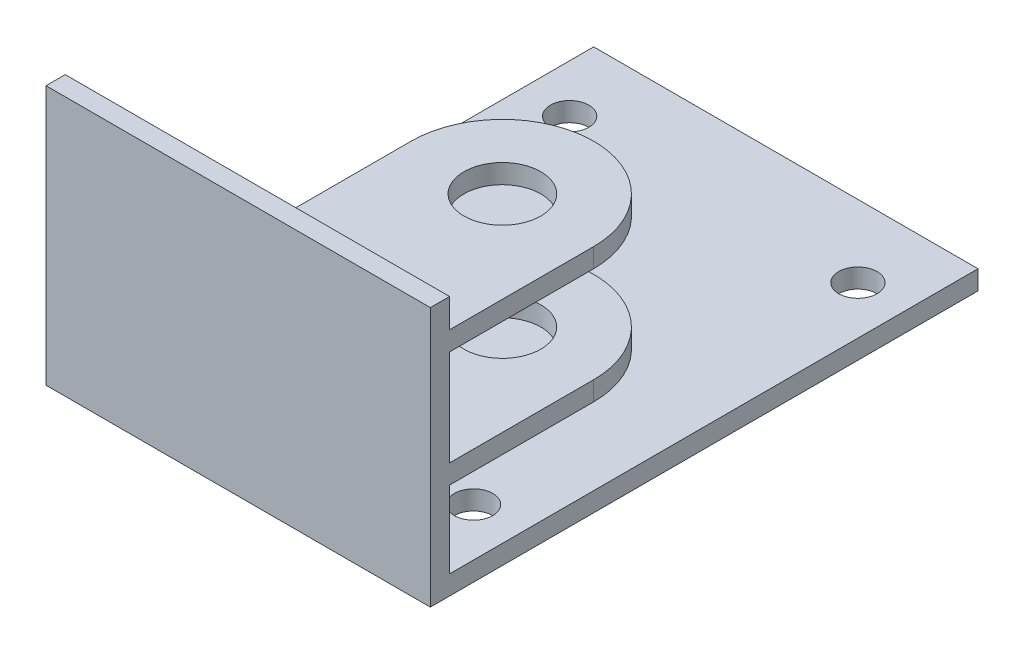
ISO-10303-21;
HEADER;
FILE_DESCRIPTION(('STEP AP214'),'2;1');
FILE_NAME('part.step','',(''),(''),'','','');
FILE_SCHEMA(('AUTOMOTIVE_DESIGN { 1 0 10303 214 1 1 1 1 }'));
ENDSEC;
DATA;
#1=APPLICATION_CONTEXT('core data for automotive mechanical design processes');
#2=APPLICATION_PROTOCOL_DEFINITION('international standard','automotive_design',2000,#1);
#3=PRODUCT_CONTEXT('',#1,'mechanical');
#4=PRODUCT('Part','Part','',(#3));
#5=PRODUCT_RELATED_PRODUCT_CATEGORY('part','',(#4));
#6=PRODUCT_DEFINITION_FORMATION('','',#4);
#7=PRODUCT_DEFINITION_CONTEXT('part definition',#1,'design');
#8=PRODUCT_DEFINITION('design','',#6,#7);
#9=PRODUCT_DEFINITION_SHAPE('','',#8);
#10=(LENGTH_UNIT() NAMED_UNIT(*) SI_UNIT(.MILLI.,.METRE.));
#11=(NAMED_UNIT(*) PLANE_ANGLE_UNIT() SI_UNIT($,.RADIAN.));
#12=(NAMED_UNIT(*) SI_UNIT($,.STERADIAN.) SOLID_ANGLE_UNIT());
#13=UNCERTAINTY_MEASURE_WITH_UNIT(LENGTH_MEASURE(1.E-05),#10,'distance_accuracy_value','');
#14=(GEOMETRIC_REPRESENTATION_CONTEXT(3) GLOBAL_UNCERTAINTY_ASSIGNED_CONTEXT((#13)) GLOBAL_UNIT_ASSIGNED_CONTEXT((#10,
#11,#12)) REPRESENTATION_CONTEXT('',''));
#15=CARTESIAN_POINT('',(0.,0.,0.));
#16=DIRECTION('',(0.,0.,1.));
#17=DIRECTION('',(1.,0.,0.));
#18=AXIS2_PLACEMENT_3D('',#15,#16,#17);
#19=CARTESIAN_POINT('',(0.,2.,0.));
#20=DIRECTION('',(0.,-1.,0.));
#21=DIRECTION('',(0.,0.,-1.));
#22=AXIS2_PLACEMENT_3D('',#19,#20,#21);
#23=PLANE('',#22);
#24=DIRECTION('',(0.,0.,1.));
#25=VECTOR('',#24,1.);
#26=CARTESIAN_POINT('',(0.,2.,0.));
#27=LINE('',#26,#25);
#28=CARTESIAN_POINT('',(0.,2.,-55.));
#29=VERTEX_POINT('',#28);
#30=CARTESIAN_POINT('',(0.,2.00000000000002,0.));
#31=VERTEX_POINT('',#30);
#32=EDGE_CURVE('E195',#29,#31,#27,.T.);
#33=ORIENTED_EDGE('',*,*,#32,.T.);
#34=DIRECTION('',(1.,0.,0.));
#35=VECTOR('',#34,1.);
#36=CARTESIAN_POINT('',(0.,2.,0.));
#37=LINE('',#36,#35);
#38=CARTESIAN_POINT('',(40.,2.,0.));
#39=VERTEX_POINT('',#38);
#40=EDGE_CURVE('E154',#31,#39,#37,.T.);
#41=ORIENTED_EDGE('',*,*,#40,.T.);
#42=DIRECTION('',(0.,0.,-1.));
#43=VECTOR('',#42,1.);
#44=CARTESIAN_POINT('',(40.,2.,0.));
#45=LINE('',#44,#43);
#46=CARTESIAN_POINT('',(40.,2.,-55.));
#47=VERTEX_POINT('',#46);
#48=EDGE_CURVE('E199',#39,#47,#45,.T.);
#49=ORIENTED_EDGE('',*,*,#48,.T.);
#50=DIRECTION('',(-1.,0.,0.));
#51=VECTOR('',#50,1.);
#52=CARTESIAN_POINT('',(0.,2.,-55.));
#53=LINE('',#52,#51);
#54=EDGE_CURVE('E201',#47,#29,#53,.T.);
#55=ORIENTED_EDGE('',*,*,#54,.T.);
#56=EDGE_LOOP('',(#33,#41,#49,#55));
#57=FACE_BOUND('',#56,.T.);
#58=CARTESIAN_POINT('',(5.,2.,-47.5));
#59=DIRECTION('',(0.,1.,0.));
#60=DIRECTION('',(0.,0.,1.));
#61=AXIS2_PLACEMENT_3D('',#58,#59,#60);
#62=CIRCLE('',#61,2.);
#63=CARTESIAN_POINT('',(5.,2.,-45.5));
#64=VERTEX_POINT('',#63);
#65=EDGE_CURVE('E189',#64,#64,#62,.T.);
#66=ORIENTED_EDGE('',*,*,#65,.F.);
#67=EDGE_LOOP('',(#66));
#68=FACE_BOUND('',#67,.T.);
#69=CARTESIAN_POINT('',(35.,2.,-47.5));
#70=DIRECTION('',(0.,1.,0.));
#71=DIRECTION('',(0.,0.,1.));
#72=AXIS2_PLACEMENT_3D('',#69,#70,#71);
#73=CIRCLE('',#72,2.);
#74=CARTESIAN_POINT('',(35.,2.,-45.5));
#75=VERTEX_POINT('',#74);
#76=EDGE_CURVE('E183',#75,#75,#73,.T.);
#77=ORIENTED_EDGE('',*,*,#76,.F.);
#78=EDGE_LOOP('',(#77));
#79=FACE_BOUND('',#78,.T.);
#80=CARTESIAN_POINT('',(35.,2.,-7.5));
#81=DIRECTION('',(0.,1.,0.));
#82=DIRECTION('',(0.,0.,1.));
#83=AXIS2_PLACEMENT_3D('',#80,#81,#82);
#84=CIRCLE('',#83,2.);
#85=CARTESIAN_POINT('',(35.,2.,-5.5));
#86=VERTEX_POINT('',#85);
#87=EDGE_CURVE('E177',#86,#86,#84,.T.);
#88=ORIENTED_EDGE('',*,*,#87,.F.);
#89=EDGE_LOOP('',(#88));
#90=FACE_BOUND('',#89,.T.);
#91=CARTESIAN_POINT('',(5.,2.,-7.5));
#92=DIRECTION('',(0.,1.,0.));
#93=DIRECTION('',(0.,0.,1.));
#94=AXIS2_PLACEMENT_3D('',#91,#92,#93);
#95=CIRCLE('',#94,2.);
#96=CARTESIAN_POINT('',(5.,2.,-5.5));
#97=VERTEX_POINT('',#96);
#98=EDGE_CURVE('E171',#97,#97,#95,.T.);
#99=ORIENTED_EDGE('',*,*,#98,.F.);
#100=EDGE_LOOP('',(#99));
#101=FACE_BOUND('',#100,.T.);
#102=ADVANCED_FACE('F37',(#57,#68,#79,#90,#101),#23,.F.);
#103=CARTESIAN_POINT('',(0.,0.,0.));
#104=DIRECTION('',(0.,-1.,0.));
#105=DIRECTION('',(0.,0.,-1.));
#106=AXIS2_PLACEMENT_3D('',#103,#104,#105);
#107=PLANE('',#106);
#108=CARTESIAN_POINT('',(35.,0.,-7.5));
#109=DIRECTION('',(0.,1.,0.));
#110=DIRECTION('',(0.,0.,1.));
#111=AXIS2_PLACEMENT_3D('',#108,#109,#110);
#112=CIRCLE('',#111,2.);
#113=CARTESIAN_POINT('',(35.,0.,-5.5));
#114=VERTEX_POINT('',#113);
#115=EDGE_CURVE('E174',#114,#114,#112,.T.);
#116=ORIENTED_EDGE('',*,*,#115,.T.);
#117=EDGE_LOOP('',(#116));
#118=FACE_BOUND('',#117,.T.);
#119=CARTESIAN_POINT('',(5.,0.,-47.5));
#120=DIRECTION('',(0.,1.,0.));
#121=DIRECTION('',(0.,0.,1.));
#122=AXIS2_PLACEMENT_3D('',#119,#120,#121);
#123=CIRCLE('',#122,2.);
#124=CARTESIAN_POINT('',(5.,0.,-45.5));
#125=VERTEX_POINT('',#124);
#126=EDGE_CURVE('E186',#125,#125,#123,.T.);
#127=ORIENTED_EDGE('',*,*,#126,.T.);
#128=EDGE_LOOP('',(#127));
#129=FACE_BOUND('',#128,.T.);
#130=DIRECTION('',(0.,0.,1.));
#131=VECTOR('',#130,1.);
#132=CARTESIAN_POINT('',(0.,0.,0.));
#133=LINE('',#132,#131);
#134=CARTESIAN_POINT('',(0.,0.,-55.));
#135=VERTEX_POINT('',#134);
#136=CARTESIAN_POINT('',(0.,0.,2.));
#137=VERTEX_POINT('',#136);
#138=EDGE_CURVE('E192',#135,#137,#133,.T.);
#139=ORIENTED_EDGE('',*,*,#138,.F.);
#140=DIRECTION('',(-1.,0.,0.));
#141=VECTOR('',#140,1.);
#142=CARTESIAN_POINT('',(0.,0.,-55.));
#143=LINE('',#142,#141);
#144=CARTESIAN_POINT('',(40.,0.,-55.));
#145=VERTEX_POINT('',#144);
#146=EDGE_CURVE('E197',#145,#135,#143,.T.);
#147=ORIENTED_EDGE('',*,*,#146,.F.);
#148=DIRECTION('',(0.,0.,-1.));
#149=VECTOR('',#148,1.);
#150=CARTESIAN_POINT('',(40.,0.,0.));
#151=LINE('',#150,#149);
#152=CARTESIAN_POINT('',(40.,0.,2.));
#153=VERTEX_POINT('',#152);
#154=EDGE_CURVE('E204',#153,#145,#151,.T.);
#155=ORIENTED_EDGE('',*,*,#154,.F.);
#156=DIRECTION('',(1.,0.,0.));
#157=VECTOR('',#156,1.);
#158=CARTESIAN_POINT('',(0.,0.,2.));
#159=LINE('',#158,#157);
#160=EDGE_CURVE('E157',#137,#153,#159,.T.);
#161=ORIENTED_EDGE('',*,*,#160,.F.);
#162=EDGE_LOOP('',(#139,#147,#155,#161));
#163=FACE_BOUND('',#162,.T.);
#164=CARTESIAN_POINT('',(35.,0.,-47.5));
#165=DIRECTION('',(0.,1.,0.));
#166=DIRECTION('',(0.,0.,1.));
#167=AXIS2_PLACEMENT_3D('',#164,#165,#166);
#168=CIRCLE('',#167,2.);
#169=CARTESIAN_POINT('',(35.,0.,-45.5));
#170=VERTEX_POINT('',#169);
#171=EDGE_CURVE('E180',#170,#170,#168,.T.);
#172=ORIENTED_EDGE('',*,*,#171,.T.);
#173=EDGE_LOOP('',(#172));
#174=FACE_BOUND('',#173,.T.);
#175=CARTESIAN_POINT('',(5.,0.,-7.5));
#176=DIRECTION('',(0.,1.,0.));
#177=DIRECTION('',(0.,0.,1.));
#178=AXIS2_PLACEMENT_3D('',#175,#176,#177);
#179=CIRCLE('',#178,2.);
#180=CARTESIAN_POINT('',(5.,0.,-5.5));
#181=VERTEX_POINT('',#180);
#182=EDGE_CURVE('E170',#181,#181,#179,.T.);
#183=ORIENTED_EDGE('',*,*,#182,.T.);
#184=EDGE_LOOP('',(#183));
#185=FACE_BOUND('',#184,.T.);
#186=ADVANCED_FACE('F214',(#118,#129,#163,#174,#185),#107,.T.);
#187=CARTESIAN_POINT('',(0.,2.,0.));
#188=DIRECTION('',(1.,0.,0.));
#189=DIRECTION('',(0.,0.,-1.));
#190=AXIS2_PLACEMENT_3D('',#187,#188,#189);
#191=PLANE('',#190);
#192=DIRECTION('',(0.,-1.,0.));
#193=VECTOR('',#192,1.);
#194=CARTESIAN_POINT('',(0.,42.,2.));
#195=LINE('',#194,#193);
#196=CARTESIAN_POINT('',(0.,27.,2.));
#197=VERTEX_POINT('',#196);
#198=EDGE_CURVE('E149',#197,#137,#195,.T.);
#199=ORIENTED_EDGE('',*,*,#198,.F.);
#200=DIRECTION('',(0.,0.,-1.));
#201=VECTOR('',#200,1.);
#202=CARTESIAN_POINT('',(0.,27.,10.));
#203=LINE('',#202,#201);
#204=CARTESIAN_POINT('',(0.,27.,0.));
#205=VERTEX_POINT('',#204);
#206=EDGE_CURVE('E138',#197,#205,#203,.T.);
#207=ORIENTED_EDGE('',*,*,#206,.T.);
#208=DIRECTION('',(0.,-1.,0.));
#209=VECTOR('',#208,1.);
#210=CARTESIAN_POINT('',(0.,42.,0.));
#211=LINE('',#210,#209);
#212=EDGE_CURVE('E146',#205,#31,#211,.T.);
#213=ORIENTED_EDGE('',*,*,#212,.T.);
#214=ORIENTED_EDGE('',*,*,#32,.F.);
#215=DIRECTION('',(0.,-1.,0.));
#216=VECTOR('',#215,1.);
#217=CARTESIAN_POINT('',(0.,2.,-55.));
#218=LINE('',#217,#216);
#219=EDGE_CURVE('E45',#29,#135,#218,.T.);
#220=ORIENTED_EDGE('',*,*,#219,.T.);
#221=ORIENTED_EDGE('',*,*,#138,.T.);
#222=EDGE_LOOP('',(#199,#207,#213,#214,#220,#221));
#223=FACE_BOUND('',#222,.T.);
#224=ADVANCED_FACE('F39',(#223),#191,.F.);
#225=CARTESIAN_POINT('',(40.,2.,0.));
#226=DIRECTION('',(-1.,0.,0.));
#227=DIRECTION('',(0.,0.,1.));
#228=AXIS2_PLACEMENT_3D('',#225,#226,#227);
#229=PLANE('',#228);
#230=DIRECTION('',(0.,-1.,0.));
#231=VECTOR('',#230,1.);
#232=CARTESIAN_POINT('',(40.,42.,0.));
#233=LINE('',#232,#231);
#234=CARTESIAN_POINT('',(40.,27.,0.));
#235=VERTEX_POINT('',#234);
#236=CARTESIAN_POINT('',(40.,24.,0.));
#237=VERTEX_POINT('',#236);
#238=EDGE_CURVE('E161',#235,#237,#233,.T.);
#239=ORIENTED_EDGE('',*,*,#238,.F.);
#240=DIRECTION('',(0.,0.,-1.));
#241=VECTOR('',#240,1.);
#242=CARTESIAN_POINT('',(40.,27.,10.));
#243=LINE('',#242,#241);
#244=CARTESIAN_POINT('',(40.,27.,2.));
#245=VERTEX_POINT('',#244);
#246=EDGE_CURVE('E52',#245,#235,#243,.T.);
#247=ORIENTED_EDGE('',*,*,#246,.F.);
#248=DIRECTION('',(0.,-1.,0.));
#249=VECTOR('',#248,1.);
#250=CARTESIAN_POINT('',(40.,42.,2.));
#251=LINE('',#250,#249);
#252=EDGE_CURVE('E167',#245,#153,#251,.T.);
#253=ORIENTED_EDGE('',*,*,#252,.T.);
#254=ORIENTED_EDGE('',*,*,#154,.T.);
#255=DIRECTION('',(0.,-1.,0.));
#256=VECTOR('',#255,1.);
#257=CARTESIAN_POINT('',(40.,2.,-55.));
#258=LINE('',#257,#256);
#259=EDGE_CURVE('E11',#47,#145,#258,.T.);
#260=ORIENTED_EDGE('',*,*,#259,.F.);
#261=ORIENTED_EDGE('',*,*,#48,.F.);
#262=CARTESIAN_POINT('',(40.,10.,0.));
#263=VERTEX_POINT('',#262);
#264=EDGE_CURVE('E156',#263,#39,#233,.T.);
#265=ORIENTED_EDGE('',*,*,#264,.F.);
#266=DIRECTION('',(0.,0.,-1.));
#267=VECTOR('',#266,1.);
#268=CARTESIAN_POINT('',(40.,10.,-15.));
#269=LINE('',#268,#267);
#270=CARTESIAN_POINT('',(40.,10.,-15.));
#271=VERTEX_POINT('',#270);
#272=EDGE_CURVE('E234',#263,#271,#269,.T.);
#273=ORIENTED_EDGE('',*,*,#272,.T.);
#274=DIRECTION('',(0.,-1.,0.));
#275=VECTOR('',#274,1.);
#276=CARTESIAN_POINT('',(40.,12.,-15.));
#277=LINE('',#276,#275);
#278=CARTESIAN_POINT('',(40.,12.,-15.));
#279=VERTEX_POINT('',#278);
#280=EDGE_CURVE('E239',#279,#271,#277,.T.);
#281=ORIENTED_EDGE('',*,*,#280,.F.);
#282=DIRECTION('',(0.,0.,-1.));
#283=VECTOR('',#282,1.);
#284=CARTESIAN_POINT('',(40.,12.,-15.));
#285=LINE('',#284,#283);
#286=CARTESIAN_POINT('',(40.,12.,0.));
#287=VERTEX_POINT('',#286);
#288=EDGE_CURVE('E237',#287,#279,#285,.T.);
#289=ORIENTED_EDGE('',*,*,#288,.F.);
#290=CARTESIAN_POINT('',(40.,22.,0.));
#291=VERTEX_POINT('',#290);
#292=EDGE_CURVE('E159',#291,#287,#233,.T.);
#293=ORIENTED_EDGE('',*,*,#292,.F.);
#294=DIRECTION('',(0.,0.,-1.));
#295=VECTOR('',#294,1.);
#296=CARTESIAN_POINT('',(40.,22.,-15.));
#297=LINE('',#296,#295);
#298=CARTESIAN_POINT('',(40.,22.,-15.));
#299=VERTEX_POINT('',#298);
#300=EDGE_CURVE('E267',#291,#299,#297,.T.);
#301=ORIENTED_EDGE('',*,*,#300,.T.);
#302=DIRECTION('',(0.,-1.,0.));
#303=VECTOR('',#302,1.);
#304=CARTESIAN_POINT('',(40.,24.,-15.));
#305=LINE('',#304,#303);
#306=CARTESIAN_POINT('',(40.,24.,-15.));
#307=VERTEX_POINT('',#306);
#308=EDGE_CURVE('E275',#307,#299,#305,.T.);
#309=ORIENTED_EDGE('',*,*,#308,.F.);
#310=DIRECTION('',(0.,0.,-1.));
#311=VECTOR('',#310,1.);
#312=CARTESIAN_POINT('',(40.,24.,-15.));
#313=LINE('',#312,#311);
#314=EDGE_CURVE('E273',#237,#307,#313,.T.);
#315=ORIENTED_EDGE('',*,*,#314,.F.);
#316=EDGE_LOOP('',(#239,#247,#253,#254,#260,#261,#265,#273,#281,#289,#293,#301,#309,#315));
#317=FACE_BOUND('',#316,.T.);
#318=ADVANCED_FACE('F308',(#317),#229,.F.);
#319=CARTESIAN_POINT('',(0.,2.,-55.));
#320=DIRECTION('',(0.,0.,1.));
#321=DIRECTION('',(1.,0.,0.));
#322=AXIS2_PLACEMENT_3D('',#319,#320,#321);
#323=PLANE('',#322);
#324=ORIENTED_EDGE('',*,*,#146,.T.);
#325=ORIENTED_EDGE('',*,*,#219,.F.);
#326=ORIENTED_EDGE('',*,*,#54,.F.);
#327=ORIENTED_EDGE('',*,*,#259,.T.);
#328=EDGE_LOOP('',(#324,#325,#326,#327));
#329=FACE_BOUND('',#328,.T.);
#330=ADVANCED_FACE('F351',(#329),#323,.F.);
#331=CARTESIAN_POINT('',(5.,2.,-47.5));
#332=DIRECTION('',(0.,-1.,0.));
#333=DIRECTION('',(0.,0.,-1.));
#334=AXIS2_PLACEMENT_3D('',#331,#332,#333);
#335=CYLINDRICAL_SURFACE('',#334,2.);
#336=ORIENTED_EDGE('',*,*,#65,.T.);
#337=EDGE_LOOP('',(#336));
#338=FACE_BOUND('',#337,.T.);
#339=ORIENTED_EDGE('',*,*,#126,.F.);
#340=EDGE_LOOP('',(#339));
#341=FACE_BOUND('',#340,.T.);
#342=ADVANCED_FACE('F348',(#338,#341),#335,.F.);
#343=CARTESIAN_POINT('',(35.,2.,-47.5));
#344=DIRECTION('',(0.,-1.,0.));
#345=DIRECTION('',(0.,0.,-1.));
#346=AXIS2_PLACEMENT_3D('',#343,#344,#345);
#347=CYLINDRICAL_SURFACE('',#346,2.);
#348=ORIENTED_EDGE('',*,*,#76,.T.);
#349=EDGE_LOOP('',(#348));
#350=FACE_BOUND('',#349,.T.);
#351=ORIENTED_EDGE('',*,*,#171,.F.);
#352=EDGE_LOOP('',(#351));
#353=FACE_BOUND('',#352,.T.);
#354=ADVANCED_FACE('F489',(#350,#353),#347,.F.);
#355=CARTESIAN_POINT('',(35.,2.,-7.5));
#356=DIRECTION('',(0.,-1.,0.));
#357=DIRECTION('',(0.,0.,-1.));
#358=AXIS2_PLACEMENT_3D('',#355,#356,#357);
#359=CYLINDRICAL_SURFACE('',#358,2.);
#360=ORIENTED_EDGE('',*,*,#87,.T.);
#361=EDGE_LOOP('',(#360));
#362=FACE_BOUND('',#361,.T.);
#363=ORIENTED_EDGE('',*,*,#115,.F.);
#364=EDGE_LOOP('',(#363));
#365=FACE_BOUND('',#364,.T.);
#366=ADVANCED_FACE('F479',(#362,#365),#359,.F.);
#367=CARTESIAN_POINT('',(5.,2.,-7.5));
#368=DIRECTION('',(0.,-1.,0.));
#369=DIRECTION('',(0.,0.,-1.));
#370=AXIS2_PLACEMENT_3D('',#367,#368,#369);
#371=CYLINDRICAL_SURFACE('',#370,2.);
#372=ORIENTED_EDGE('',*,*,#98,.T.);
#373=EDGE_LOOP('',(#372));
#374=FACE_BOUND('',#373,.T.);
#375=ORIENTED_EDGE('',*,*,#182,.F.);
#376=EDGE_LOOP('',(#375));
#377=FACE_BOUND('',#376,.T.);
#378=ADVANCED_FACE('F379',(#374,#377),#371,.F.);
#379=CARTESIAN_POINT('',(0.,42.,2.));
#380=DIRECTION('',(0.,0.,-1.));
#381=DIRECTION('',(-1.,0.,0.));
#382=AXIS2_PLACEMENT_3D('',#379,#380,#381);
#383=PLANE('',#382);
#384=ORIENTED_EDGE('',*,*,#252,.F.);
#385=DIRECTION('',(-1.,0.,0.));
#386=VECTOR('',#385,1.);
#387=CARTESIAN_POINT('',(0.,27.,2.));
#388=LINE('',#387,#386);
#389=EDGE_CURVE('E150',#245,#197,#388,.T.);
#390=ORIENTED_EDGE('',*,*,#389,.T.);
#391=ORIENTED_EDGE('',*,*,#198,.T.);
#392=ORIENTED_EDGE('',*,*,#160,.T.);
#393=EDGE_LOOP('',(#384,#390,#391,#392));
#394=FACE_BOUND('',#393,.T.);
#395=ADVANCED_FACE('F219',(#394),#383,.F.);
#396=CARTESIAN_POINT('',(0.,42.,0.));
#397=DIRECTION('',(0.,0.,1.));
#398=DIRECTION('',(1.,0.,0.));
#399=AXIS2_PLACEMENT_3D('',#396,#397,#398);
#400=PLANE('',#399);
#401=ORIENTED_EDGE('',*,*,#212,.F.);
#402=DIRECTION('',(-1.,0.,0.));
#403=VECTOR('',#402,1.);
#404=CARTESIAN_POINT('',(0.,27.,0.));
#405=LINE('',#404,#403);
#406=EDGE_CURVE('E135',#235,#205,#405,.T.);
#407=ORIENTED_EDGE('',*,*,#406,.F.);
#408=ORIENTED_EDGE('',*,*,#238,.T.);
#409=DIRECTION('',(1.,0.,0.));
#410=VECTOR('',#409,1.);
#411=CARTESIAN_POINT('',(40.,24.,0.));
#412=LINE('',#411,#410);
#413=CARTESIAN_POINT('',(21.,24.,0.));
#414=VERTEX_POINT('',#413);
#415=EDGE_CURVE('E270',#414,#237,#412,.T.);
#416=ORIENTED_EDGE('',*,*,#415,.F.);
#417=DIRECTION('',(0.,-1.,0.));
#418=VECTOR('',#417,1.);
#419=CARTESIAN_POINT('',(21.,24.,0.));
#420=LINE('',#419,#418);
#421=CARTESIAN_POINT('',(21.,22.,0.));
#422=VERTEX_POINT('',#421);
#423=EDGE_CURVE('E287',#414,#422,#420,.T.);
#424=ORIENTED_EDGE('',*,*,#423,.T.);
#425=DIRECTION('',(1.,0.,0.));
#426=VECTOR('',#425,1.);
#427=CARTESIAN_POINT('',(40.,22.,0.));
#428=LINE('',#427,#426);
#429=EDGE_CURVE('E281',#422,#291,#428,.T.);
#430=ORIENTED_EDGE('',*,*,#429,.T.);
#431=ORIENTED_EDGE('',*,*,#292,.T.);
#432=DIRECTION('',(1.,0.,0.));
#433=VECTOR('',#432,1.);
#434=CARTESIAN_POINT('',(40.,12.,0.));
#435=LINE('',#434,#433);
#436=CARTESIAN_POINT('',(21.,12.,0.));
#437=VERTEX_POINT('',#436);
#438=EDGE_CURVE('E60',#437,#287,#435,.T.);
#439=ORIENTED_EDGE('',*,*,#438,.F.);
#440=DIRECTION('',(0.,-1.,0.));
#441=VECTOR('',#440,1.);
#442=CARTESIAN_POINT('',(21.,12.,0.));
#443=LINE('',#442,#441);
#444=CARTESIAN_POINT('',(21.,10.,0.));
#445=VERTEX_POINT('',#444);
#446=EDGE_CURVE('E251',#437,#445,#443,.T.);
#447=ORIENTED_EDGE('',*,*,#446,.T.);
#448=DIRECTION('',(1.,0.,0.));
#449=VECTOR('',#448,1.);
#450=CARTESIAN_POINT('',(40.,10.,0.));
#451=LINE('',#450,#449);
#452=EDGE_CURVE('E245',#445,#263,#451,.T.);
#453=ORIENTED_EDGE('',*,*,#452,.T.);
#454=ORIENTED_EDGE('',*,*,#264,.T.);
#455=ORIENTED_EDGE('',*,*,#40,.F.);
#456=EDGE_LOOP('',(#401,#407,#408,#416,#424,#430,#431,#439,#447,#453,#454,#455));
#457=FACE_BOUND('',#456,.T.);
#458=ADVANCED_FACE('F152',(#457),#400,.F.);
#459=CARTESIAN_POINT('',(30.5,24.,-15.));
#460=DIRECTION('',(0.,1.,0.));
#461=DIRECTION('',(0.,0.,1.));
#462=AXIS2_PLACEMENT_3D('',#459,#460,#461);
#463=PLANE('',#462);
#464=CARTESIAN_POINT('',(30.5,24.,-15.));
#465=DIRECTION('',(0.,1.,0.));
#466=DIRECTION('',(0.,0.,1.));
#467=AXIS2_PLACEMENT_3D('',#464,#465,#466);
#468=CIRCLE('',#467,9.5);
#469=CARTESIAN_POINT('',(21.,24.,-15.));
#470=VERTEX_POINT('',#469);
#471=EDGE_CURVE('E263',#307,#470,#468,.T.);
#472=ORIENTED_EDGE('',*,*,#471,.T.);
#473=DIRECTION('',(0.,0.,1.));
#474=VECTOR('',#473,1.);
#475=CARTESIAN_POINT('',(21.,24.,0.));
#476=LINE('',#475,#474);
#477=EDGE_CURVE('E266',#470,#414,#476,.T.);
#478=ORIENTED_EDGE('',*,*,#477,.T.);
#479=ORIENTED_EDGE('',*,*,#415,.T.);
#480=ORIENTED_EDGE('',*,*,#314,.T.);
#481=EDGE_LOOP('',(#472,#478,#479,#480));
#482=FACE_BOUND('',#481,.T.);
#483=CARTESIAN_POINT('',(30.5,24.,-15.));
#484=DIRECTION('',(0.,1.,0.));
#485=DIRECTION('',(0.,0.,1.));
#486=AXIS2_PLACEMENT_3D('',#483,#484,#485);
#487=CIRCLE('',#486,4.00000000000001);
#488=CARTESIAN_POINT('',(30.5,24.,-11.));
#489=VERTEX_POINT('',#488);
#490=EDGE_CURVE('E257',#489,#489,#487,.T.);
#491=ORIENTED_EDGE('',*,*,#490,.F.);
#492=EDGE_LOOP('',(#491));
#493=FACE_BOUND('',#492,.T.);
#494=ADVANCED_FACE('F305',(#482,#493),#463,.T.);
#495=CARTESIAN_POINT('',(30.5,22.,-15.));
#496=DIRECTION('',(0.,1.,0.));
#497=DIRECTION('',(0.,0.,1.));
#498=AXIS2_PLACEMENT_3D('',#495,#496,#497);
#499=PLANE('',#498);
#500=CARTESIAN_POINT('',(30.5,22.,-15.));
#501=DIRECTION('',(0.,1.,0.));
#502=DIRECTION('',(0.,0.,1.));
#503=AXIS2_PLACEMENT_3D('',#500,#501,#502);
#504=CIRCLE('',#503,9.5);
#505=CARTESIAN_POINT('',(21.,22.,-15.));
#506=VERTEX_POINT('',#505);
#507=EDGE_CURVE('E260',#299,#506,#504,.T.);
#508=ORIENTED_EDGE('',*,*,#507,.F.);
#509=ORIENTED_EDGE('',*,*,#300,.F.);
#510=ORIENTED_EDGE('',*,*,#429,.F.);
#511=DIRECTION('',(0.,0.,1.));
#512=VECTOR('',#511,1.);
#513=CARTESIAN_POINT('',(21.,22.,0.));
#514=LINE('',#513,#512);
#515=EDGE_CURVE('E278',#506,#422,#514,.T.);
#516=ORIENTED_EDGE('',*,*,#515,.F.);
#517=EDGE_LOOP('',(#508,#509,#510,#516));
#518=FACE_BOUND('',#517,.T.);
#519=CARTESIAN_POINT('',(30.5,22.,-15.));
#520=DIRECTION('',(0.,1.,0.));
#521=DIRECTION('',(0.,0.,1.));
#522=AXIS2_PLACEMENT_3D('',#519,#520,#521);
#523=CIRCLE('',#522,4.00000000000001);
#524=CARTESIAN_POINT('',(30.5,22.,-11.));
#525=VERTEX_POINT('',#524);
#526=EDGE_CURVE('E256',#525,#525,#523,.T.);
#527=ORIENTED_EDGE('',*,*,#526,.T.);
#528=EDGE_LOOP('',(#527));
#529=FACE_BOUND('',#528,.T.);
#530=ADVANCED_FACE('F301',(#518,#529),#499,.F.);
#531=CARTESIAN_POINT('',(30.5,24.,-15.));
#532=DIRECTION('',(0.,-1.,0.));
#533=DIRECTION('',(0.,0.,-1.));
#534=AXIS2_PLACEMENT_3D('',#531,#532,#533);
#535=CYLINDRICAL_SURFACE('',#534,9.5);
#536=ORIENTED_EDGE('',*,*,#507,.T.);
#537=DIRECTION('',(0.,-1.,0.));
#538=VECTOR('',#537,1.);
#539=CARTESIAN_POINT('',(21.,24.,-15.));
#540=LINE('',#539,#538);
#541=EDGE_CURVE('E163',#470,#506,#540,.T.);
#542=ORIENTED_EDGE('',*,*,#541,.F.);
#543=ORIENTED_EDGE('',*,*,#471,.F.);
#544=ORIENTED_EDGE('',*,*,#308,.T.);
#545=EDGE_LOOP('',(#536,#542,#543,#544));
#546=FACE_BOUND('',#545,.T.);
#547=ADVANCED_FACE('F297',(#546),#535,.T.);
#548=CARTESIAN_POINT('',(21.,24.,0.));
#549=DIRECTION('',(1.,0.,0.));
#550=DIRECTION('',(0.,0.,-1.));
#551=AXIS2_PLACEMENT_3D('',#548,#549,#550);
#552=PLANE('',#551);
#553=ORIENTED_EDGE('',*,*,#515,.T.);
#554=ORIENTED_EDGE('',*,*,#423,.F.);
#555=ORIENTED_EDGE('',*,*,#477,.F.);
#556=ORIENTED_EDGE('',*,*,#541,.T.);
#557=EDGE_LOOP('',(#553,#554,#555,#556));
#558=FACE_BOUND('',#557,.T.);
#559=ADVANCED_FACE('F291',(#558),#552,.F.);
#560=CARTESIAN_POINT('',(30.5,24.,-15.));
#561=DIRECTION('',(0.,-1.,0.));
#562=DIRECTION('',(0.,0.,-1.));
#563=AXIS2_PLACEMENT_3D('',#560,#561,#562);
#564=CYLINDRICAL_SURFACE('',#563,4.00000000000001);
#565=ORIENTED_EDGE('',*,*,#490,.T.);
#566=EDGE_LOOP('',(#565));
#567=FACE_BOUND('',#566,.T.);
#568=ORIENTED_EDGE('',*,*,#526,.F.);
#569=EDGE_LOOP('',(#568));
#570=FACE_BOUND('',#569,.T.);
#571=ADVANCED_FACE('F421',(#567,#570),#564,.F.);
#572=CARTESIAN_POINT('',(30.5,12.,-15.));
#573=DIRECTION('',(0.,1.,0.));
#574=DIRECTION('',(0.,0.,1.));
#575=AXIS2_PLACEMENT_3D('',#572,#573,#574);
#576=PLANE('',#575);
#577=CARTESIAN_POINT('',(30.5,12.,-15.));
#578=DIRECTION('',(0.,1.,0.));
#579=DIRECTION('',(0.,0.,1.));
#580=AXIS2_PLACEMENT_3D('',#577,#578,#579);
#581=CIRCLE('',#580,9.5);
#582=CARTESIAN_POINT('',(21.,12.,-15.));
#583=VERTEX_POINT('',#582);
#584=EDGE_CURVE('E230',#279,#583,#581,.T.);
#585=ORIENTED_EDGE('',*,*,#584,.T.);
#586=DIRECTION('',(0.,0.,1.));
#587=VECTOR('',#586,1.);
#588=CARTESIAN_POINT('',(21.,12.,0.));
#589=LINE('',#588,#587);
#590=EDGE_CURVE('E233',#583,#437,#589,.T.);
#591=ORIENTED_EDGE('',*,*,#590,.T.);
#592=ORIENTED_EDGE('',*,*,#438,.T.);
#593=ORIENTED_EDGE('',*,*,#288,.T.);
#594=EDGE_LOOP('',(#585,#591,#592,#593));
#595=FACE_BOUND('',#594,.T.);
#596=CARTESIAN_POINT('',(30.5,12.,-15.));
#597=DIRECTION('',(0.,1.,0.));
#598=DIRECTION('',(0.,0.,1.));
#599=AXIS2_PLACEMENT_3D('',#596,#597,#598);
#600=CIRCLE('',#599,4.00000000000001);
#601=CARTESIAN_POINT('',(30.5,12.,-11.));
#602=VERTEX_POINT('',#601);
#603=EDGE_CURVE('E223',#602,#602,#600,.T.);
#604=ORIENTED_EDGE('',*,*,#603,.F.);
#605=EDGE_LOOP('',(#604));
#606=FACE_BOUND('',#605,.T.);
#607=ADVANCED_FACE('F313',(#595,#606),#576,.T.);
#608=CARTESIAN_POINT('',(30.5,10.,-15.));
#609=DIRECTION('',(0.,1.,0.));
#610=DIRECTION('',(0.,0.,1.));
#611=AXIS2_PLACEMENT_3D('',#608,#609,#610);
#612=PLANE('',#611);
#613=CARTESIAN_POINT('',(30.5,10.,-15.));
#614=DIRECTION('',(0.,1.,0.));
#615=DIRECTION('',(0.,0.,1.));
#616=AXIS2_PLACEMENT_3D('',#613,#614,#615);
#617=CIRCLE('',#616,9.5);
#618=CARTESIAN_POINT('',(21.,10.,-15.));
#619=VERTEX_POINT('',#618);
#620=EDGE_CURVE('E228',#271,#619,#617,.T.);
#621=ORIENTED_EDGE('',*,*,#620,.F.);
#622=ORIENTED_EDGE('',*,*,#272,.F.);
#623=ORIENTED_EDGE('',*,*,#452,.F.);
#624=DIRECTION('',(0.,0.,1.));
#625=VECTOR('',#624,1.);
#626=CARTESIAN_POINT('',(21.,10.,0.));
#627=LINE('',#626,#625);
#628=EDGE_CURVE('E242',#619,#445,#627,.T.);
#629=ORIENTED_EDGE('',*,*,#628,.F.);
#630=EDGE_LOOP('',(#621,#622,#623,#629));
#631=FACE_BOUND('',#630,.T.);
#632=CARTESIAN_POINT('',(30.5,10.,-15.));
#633=DIRECTION('',(0.,1.,0.));
#634=DIRECTION('',(0.,0.,1.));
#635=AXIS2_PLACEMENT_3D('',#632,#633,#634);
#636=CIRCLE('',#635,4.00000000000001);
#637=CARTESIAN_POINT('',(30.5,10.,-11.));
#638=VERTEX_POINT('',#637);
#639=EDGE_CURVE('E220',#638,#638,#636,.T.);
#640=ORIENTED_EDGE('',*,*,#639,.T.);
#641=EDGE_LOOP('',(#640));
#642=FACE_BOUND('',#641,.T.);
#643=ADVANCED_FACE('F323',(#631,#642),#612,.F.);
#644=CARTESIAN_POINT('',(30.5,12.,-15.));
#645=DIRECTION('',(0.,-1.,0.));
#646=DIRECTION('',(0.,0.,-1.));
#647=AXIS2_PLACEMENT_3D('',#644,#645,#646);
#648=CYLINDRICAL_SURFACE('',#647,9.5);
#649=ORIENTED_EDGE('',*,*,#620,.T.);
#650=DIRECTION('',(0.,-1.,0.));
#651=VECTOR('',#650,1.);
#652=CARTESIAN_POINT('',(21.,12.,-15.));
#653=LINE('',#652,#651);
#654=EDGE_CURVE('E253',#583,#619,#653,.T.);
#655=ORIENTED_EDGE('',*,*,#654,.F.);
#656=ORIENTED_EDGE('',*,*,#584,.F.);
#657=ORIENTED_EDGE('',*,*,#280,.T.);
#658=EDGE_LOOP('',(#649,#655,#656,#657));
#659=FACE_BOUND('',#658,.T.);
#660=ADVANCED_FACE('F327',(#659),#648,.T.);
#661=CARTESIAN_POINT('',(21.,12.,0.));
#662=DIRECTION('',(1.,0.,0.));
#663=DIRECTION('',(0.,0.,-1.));
#664=AXIS2_PLACEMENT_3D('',#661,#662,#663);
#665=PLANE('',#664);
#666=ORIENTED_EDGE('',*,*,#628,.T.);
#667=ORIENTED_EDGE('',*,*,#446,.F.);
#668=ORIENTED_EDGE('',*,*,#590,.F.);
#669=ORIENTED_EDGE('',*,*,#654,.T.);
#670=EDGE_LOOP('',(#666,#667,#668,#669));
#671=FACE_BOUND('',#670,.T.);
#672=ADVANCED_FACE('F318',(#671),#665,.F.);
#673=CARTESIAN_POINT('',(30.5,12.,-15.));
#674=DIRECTION('',(0.,-1.,0.));
#675=DIRECTION('',(0.,0.,-1.));
#676=AXIS2_PLACEMENT_3D('',#673,#674,#675);
#677=CYLINDRICAL_SURFACE('',#676,4.00000000000001);
#678=ORIENTED_EDGE('',*,*,#603,.T.);
#679=EDGE_LOOP('',(#678));
#680=FACE_BOUND('',#679,.T.);
#681=ORIENTED_EDGE('',*,*,#639,.F.);
#682=EDGE_LOOP('',(#681));
#683=FACE_BOUND('',#682,.T.);
#684=ADVANCED_FACE('F334',(#680,#683),#677,.F.);
#685=CARTESIAN_POINT('',(0.,27.,10.));
#686=DIRECTION('',(0.,-1.,0.));
#687=DIRECTION('',(1.,0.,0.));
#688=AXIS2_PLACEMENT_3D('',#685,#686,#687);
#689=PLANE('',#688);
#690=ORIENTED_EDGE('',*,*,#246,.T.);
#691=ORIENTED_EDGE('',*,*,#406,.T.);
#692=ORIENTED_EDGE('',*,*,#206,.F.);
#693=ORIENTED_EDGE('',*,*,#389,.F.);
#694=EDGE_LOOP('',(#690,#691,#692,#693));
#695=FACE_BOUND('',#694,.T.);
#696=ADVANCED_FACE('F137',(#695),#689,.F.);
#697=CLOSED_SHELL('',(#102,#186,#224,#318,#330,#342,#354,#366,#378,#395,#458,#494,#530,#547,
#559,#571,#607,#643,#660,#672,#684,#696));
#698=MANIFOLD_SOLID_BREP('B2',#697);
#699=ADVANCED_BREP_SHAPE_REPRESENTATION('',(#18,#698),#14);
#700=SHAPE_DEFINITION_REPRESENTATION(#9,#699);
ENDSEC;
END-ISO-10303-21;
